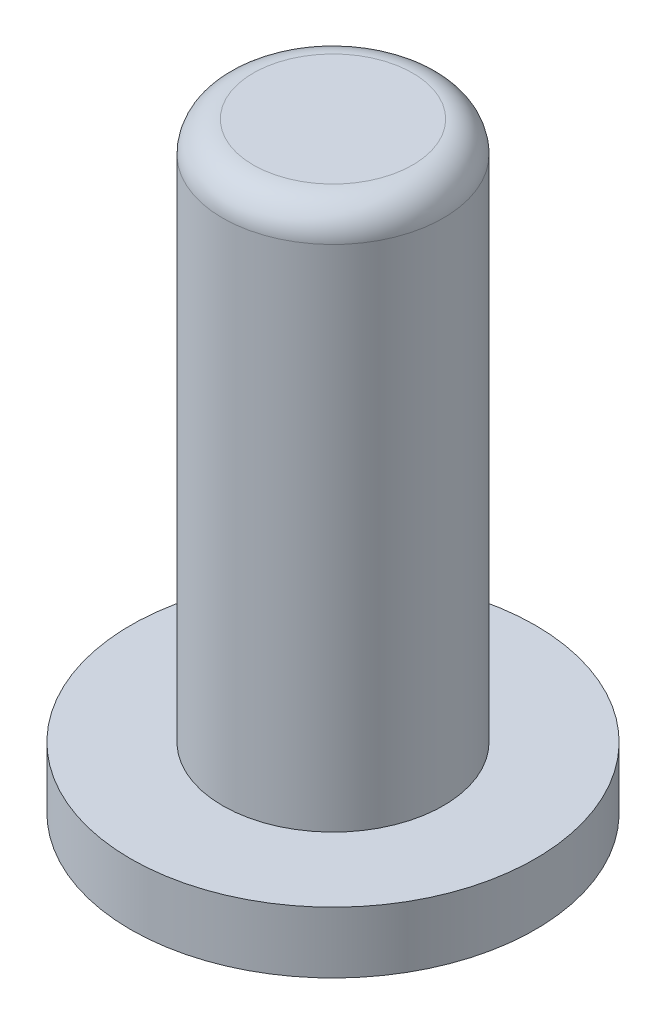
ISO-10303-21;
HEADER;
FILE_DESCRIPTION(('STEP AP214'),'2;1');
FILE_NAME('part.step','',(''),(''),'','','');
FILE_SCHEMA(('AUTOMOTIVE_DESIGN { 1 0 10303 214 1 1 1 1 }'));
ENDSEC;
DATA;
#1=APPLICATION_CONTEXT('core data for automotive mechanical design processes');
#2=APPLICATION_PROTOCOL_DEFINITION('international standard','automotive_design',2000,#1);
#3=PRODUCT_CONTEXT('',#1,'mechanical');
#4=PRODUCT('Part','Part','',(#3));
#5=PRODUCT_RELATED_PRODUCT_CATEGORY('part','',(#4));
#6=PRODUCT_DEFINITION_FORMATION('','',#4);
#7=PRODUCT_DEFINITION_CONTEXT('part definition',#1,'design');
#8=PRODUCT_DEFINITION('design','',#6,#7);
#9=PRODUCT_DEFINITION_SHAPE('','',#8);
#10=(LENGTH_UNIT() NAMED_UNIT(*) SI_UNIT(.MILLI.,.METRE.));
#11=(NAMED_UNIT(*) PLANE_ANGLE_UNIT() SI_UNIT($,.RADIAN.));
#12=(NAMED_UNIT(*) SI_UNIT($,.STERADIAN.) SOLID_ANGLE_UNIT());
#13=UNCERTAINTY_MEASURE_WITH_UNIT(LENGTH_MEASURE(1.E-05),#10,'distance_accuracy_value','');
#14=(GEOMETRIC_REPRESENTATION_CONTEXT(3) GLOBAL_UNCERTAINTY_ASSIGNED_CONTEXT((#13)) GLOBAL_UNIT_ASSIGNED_CONTEXT((#10,
#11,#12)) REPRESENTATION_CONTEXT('',''));
#15=CARTESIAN_POINT('',(0.,0.,0.));
#16=DIRECTION('',(0.,0.,1.));
#17=DIRECTION('',(1.,0.,0.));
#18=AXIS2_PLACEMENT_3D('',#15,#16,#17);
#19=CARTESIAN_POINT('',(0.,1.,0.));
#20=DIRECTION('',(0.,-1.,0.));
#21=DIRECTION('',(0.,0.,-1.));
#22=AXIS2_PLACEMENT_3D('',#19,#20,#21);
#23=CYLINDRICAL_SURFACE('',#22,3.3);
#24=CARTESIAN_POINT('',(0.,1.,0.));
#25=DIRECTION('',(0.,1.,0.));
#26=DIRECTION('',(0.,0.,1.));
#27=AXIS2_PLACEMENT_3D('',#24,#25,#26);
#28=CIRCLE('',#27,3.3);
#29=CARTESIAN_POINT('',(0.,1.,3.3));
#30=VERTEX_POINT('',#29);
#31=EDGE_CURVE('E54',#30,#30,#28,.T.);
#32=ORIENTED_EDGE('',*,*,#31,.F.);
#33=EDGE_LOOP('',(#32));
#34=FACE_BOUND('',#33,.T.);
#35=CARTESIAN_POINT('',(0.,0.,0.));
#36=DIRECTION('',(0.,1.,0.));
#37=DIRECTION('',(0.,0.,1.));
#38=AXIS2_PLACEMENT_3D('',#35,#36,#37);
#39=CIRCLE('',#38,3.3);
#40=CARTESIAN_POINT('',(0.,0.,3.3));
#41=VERTEX_POINT('',#40);
#42=EDGE_CURVE('E57',#41,#41,#39,.T.);
#43=ORIENTED_EDGE('',*,*,#42,.T.);
#44=EDGE_LOOP('',(#43));
#45=FACE_BOUND('',#44,.T.);
#46=ADVANCED_FACE('F36',(#34,#45),#23,.T.);
#47=CARTESIAN_POINT('',(0.,1.,0.));
#48=DIRECTION('',(0.,1.,0.));
#49=DIRECTION('',(0.,0.,1.));
#50=AXIS2_PLACEMENT_3D('',#47,#48,#49);
#51=PLANE('',#50);
#52=CARTESIAN_POINT('',(0.,1.,0.));
#53=DIRECTION('',(0.,1.,0.));
#54=DIRECTION('',(0.,0.,1.));
#55=AXIS2_PLACEMENT_3D('',#52,#53,#54);
#56=CIRCLE('',#55,1.8);
#57=CARTESIAN_POINT('',(0.,1.,1.8));
#58=VERTEX_POINT('',#57);
#59=EDGE_CURVE('E49',#58,#58,#56,.T.);
#60=ORIENTED_EDGE('',*,*,#59,.F.);
#61=EDGE_LOOP('',(#60));
#62=FACE_BOUND('',#61,.T.);
#63=ORIENTED_EDGE('',*,*,#31,.T.);
#64=EDGE_LOOP('',(#63));
#65=FACE_BOUND('',#64,.T.);
#66=ADVANCED_FACE('F65',(#62,#65),#51,.T.);
#67=CARTESIAN_POINT('',(0.,0.,0.));
#68=DIRECTION('',(0.,1.,0.));
#69=DIRECTION('',(0.,0.,1.));
#70=AXIS2_PLACEMENT_3D('',#67,#68,#69);
#71=PLANE('',#70);
#72=ORIENTED_EDGE('',*,*,#42,.F.);
#73=EDGE_LOOP('',(#72));
#74=FACE_BOUND('',#73,.T.);
#75=ADVANCED_FACE('F71',(#74),#71,.F.);
#76=CARTESIAN_POINT('',(0.,9.8,0.));
#77=DIRECTION('',(0.,-1.,0.));
#78=DIRECTION('',(0.,0.,-1.));
#79=AXIS2_PLACEMENT_3D('',#76,#77,#78);
#80=CYLINDRICAL_SURFACE('',#79,1.8);
#81=CARTESIAN_POINT('',(0.,9.3,0.));
#82=DIRECTION('',(0.,1.,0.));
#83=DIRECTION('',(0.,0.,1.));
#84=AXIS2_PLACEMENT_3D('',#81,#82,#83);
#85=CIRCLE('',#84,1.8);
#86=CARTESIAN_POINT('',(0.,9.3,1.8));
#87=VERTEX_POINT('',#86);
#88=EDGE_CURVE('E10',#87,#87,#85,.F.);
#89=ORIENTED_EDGE('',*,*,#88,.T.);
#90=EDGE_LOOP('',(#89));
#91=FACE_BOUND('',#90,.T.);
#92=ORIENTED_EDGE('',*,*,#59,.T.);
#93=EDGE_LOOP('',(#92));
#94=FACE_BOUND('',#93,.T.);
#95=ADVANCED_FACE('F73',(#91,#94),#80,.T.);
#96=CARTESIAN_POINT('',(0.,9.8,0.));
#97=DIRECTION('',(0.,1.,0.));
#98=DIRECTION('',(0.,0.,1.));
#99=AXIS2_PLACEMENT_3D('',#96,#97,#98);
#100=PLANE('',#99);
#101=CARTESIAN_POINT('',(0.,9.8,0.));
#102=DIRECTION('',(0.,1.,0.));
#103=DIRECTION('',(0.,0.,1.));
#104=AXIS2_PLACEMENT_3D('',#101,#102,#103);
#105=CIRCLE('',#104,1.3);
#106=CARTESIAN_POINT('',(0.,9.8,1.3));
#107=VERTEX_POINT('',#106);
#108=EDGE_CURVE('E44',#107,#107,#105,.T.);
#109=ORIENTED_EDGE('',*,*,#108,.T.);
#110=EDGE_LOOP('',(#109));
#111=FACE_BOUND('',#110,.T.);
#112=ADVANCED_FACE('F79',(#111),#100,.T.);
#113=CARTESIAN_POINT('',(0.,9.3,0.));
#114=DIRECTION('',(0.,1.,0.));
#115=DIRECTION('',(0.,0.,1.));
#116=AXIS2_PLACEMENT_3D('',#113,#114,#115);
#117=TOROIDAL_SURFACE('',#116,1.3,0.5);
#118=ORIENTED_EDGE('',*,*,#88,.F.);
#119=EDGE_LOOP('',(#118));
#120=FACE_BOUND('',#119,.T.);
#121=ORIENTED_EDGE('',*,*,#108,.F.);
#122=EDGE_LOOP('',(#121));
#123=FACE_BOUND('',#122,.T.);
#124=ADVANCED_FACE('F38',(#120,#123),#117,.T.);
#125=CLOSED_SHELL('',(#46,#66,#75,#95,#112,#124));
#126=MANIFOLD_SOLID_BREP('B2',#125);
#127=ADVANCED_BREP_SHAPE_REPRESENTATION('',(#18,#126),#14);
#128=SHAPE_DEFINITION_REPRESENTATION(#9,#127);
ENDSEC;
END-ISO-10303-21;
